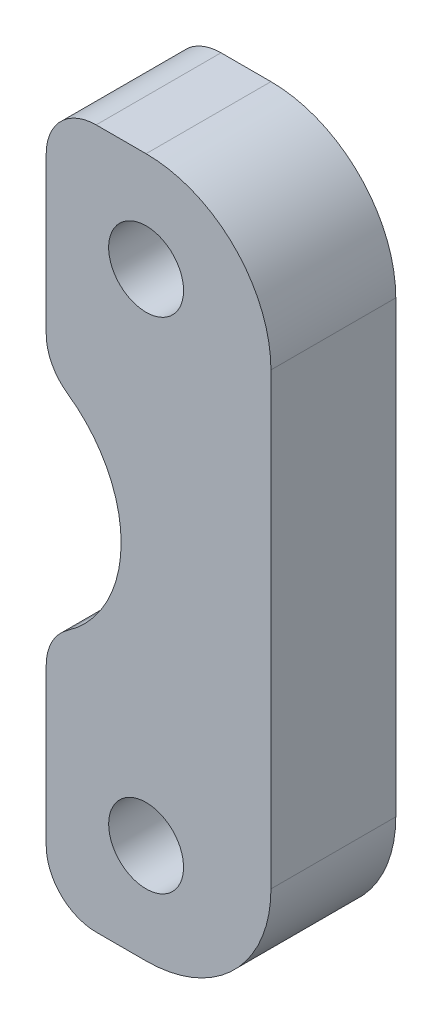
ISO-10303-21;
HEADER;
FILE_DESCRIPTION(('STEP AP214'),'2;1');
FILE_NAME('part.step','',(''),(''),'','','');
FILE_SCHEMA(('AUTOMOTIVE_DESIGN { 1 0 10303 214 1 1 1 1 }'));
ENDSEC;
DATA;
#1=APPLICATION_CONTEXT('core data for automotive mechanical design processes');
#2=APPLICATION_PROTOCOL_DEFINITION('international standard','automotive_design',2000,#1);
#3=PRODUCT_CONTEXT('',#1,'mechanical');
#4=PRODUCT('Part','Part','',(#3));
#5=PRODUCT_RELATED_PRODUCT_CATEGORY('part','',(#4));
#6=PRODUCT_DEFINITION_FORMATION('','',#4);
#7=PRODUCT_DEFINITION_CONTEXT('part definition',#1,'design');
#8=PRODUCT_DEFINITION('design','',#6,#7);
#9=PRODUCT_DEFINITION_SHAPE('','',#8);
#10=(LENGTH_UNIT() NAMED_UNIT(*) SI_UNIT(.MILLI.,.METRE.));
#11=(NAMED_UNIT(*) PLANE_ANGLE_UNIT() SI_UNIT($,.RADIAN.));
#12=(NAMED_UNIT(*) SI_UNIT($,.STERADIAN.) SOLID_ANGLE_UNIT());
#13=UNCERTAINTY_MEASURE_WITH_UNIT(LENGTH_MEASURE(1.E-05),#10,'distance_accuracy_value','');
#14=(GEOMETRIC_REPRESENTATION_CONTEXT(3) GLOBAL_UNCERTAINTY_ASSIGNED_CONTEXT((#13)) GLOBAL_UNIT_ASSIGNED_CONTEXT((#10,
#11,#12)) REPRESENTATION_CONTEXT('',''));
#15=CARTESIAN_POINT('',(0.,0.,0.));
#16=DIRECTION('',(0.,0.,1.));
#17=DIRECTION('',(1.,0.,0.));
#18=AXIS2_PLACEMENT_3D('',#15,#16,#17);
#19=CARTESIAN_POINT('',(0.,0.,5.));
#20=DIRECTION('',(0.,0.,-1.));
#21=DIRECTION('',(-1.,0.,0.));
#22=AXIS2_PLACEMENT_3D('',#19,#20,#21);
#23=PLANE('',#22);
#24=DIRECTION('',(0.,-1.,0.));
#25=VECTOR('',#24,1.);
#26=CARTESIAN_POINT('',(2.,-14.,5.));
#27=LINE('',#26,#25);
#28=CARTESIAN_POINT('',(2.,-5.74456264653803,5.));
#29=VERTEX_POINT('',#28);
#30=CARTESIAN_POINT('',(2.,-12.,5.));
#31=VERTEX_POINT('',#30);
#32=EDGE_CURVE('E232',#29,#31,#27,.T.);
#33=ORIENTED_EDGE('',*,*,#32,.T.);
#34=CARTESIAN_POINT('',(4.,-12.,5.));
#35=DIRECTION('',(0.,0.,-1.));
#36=DIRECTION('',(-1.,0.,0.));
#37=AXIS2_PLACEMENT_3D('',#34,#35,#36);
#38=CIRCLE('',#37,2.);
#39=CARTESIAN_POINT('',(4.,-14.,5.));
#40=VERTEX_POINT('',#39);
#41=EDGE_CURVE('E193',#31,#40,#38,.F.);
#42=ORIENTED_EDGE('',*,*,#41,.T.);
#43=DIRECTION('',(1.,0.,0.));
#44=VECTOR('',#43,1.);
#45=CARTESIAN_POINT('',(11.,-14.,5.));
#46=LINE('',#45,#44);
#47=CARTESIAN_POINT('',(6.,-14.,5.));
#48=VERTEX_POINT('',#47);
#49=EDGE_CURVE('E230',#40,#48,#46,.T.);
#50=ORIENTED_EDGE('',*,*,#49,.T.);
#51=CARTESIAN_POINT('',(6.,-9.,5.));
#52=DIRECTION('',(0.,0.,-1.));
#53=DIRECTION('',(-1.,0.,0.));
#54=AXIS2_PLACEMENT_3D('',#51,#52,#53);
#55=CIRCLE('',#54,5.);
#56=CARTESIAN_POINT('',(11.,-9.,5.));
#57=VERTEX_POINT('',#56);
#58=EDGE_CURVE('E167',#48,#57,#55,.F.);
#59=ORIENTED_EDGE('',*,*,#58,.T.);
#60=DIRECTION('',(0.,1.,0.));
#61=VECTOR('',#60,1.);
#62=CARTESIAN_POINT('',(11.,14.,5.));
#63=LINE('',#62,#61);
#64=CARTESIAN_POINT('',(11.,9.,5.));
#65=VERTEX_POINT('',#64);
#66=EDGE_CURVE('E146',#57,#65,#63,.T.);
#67=ORIENTED_EDGE('',*,*,#66,.T.);
#68=CARTESIAN_POINT('',(6.,9.,5.));
#69=DIRECTION('',(0.,0.,-1.));
#70=DIRECTION('',(-1.,0.,0.));
#71=AXIS2_PLACEMENT_3D('',#68,#69,#70);
#72=CIRCLE('',#71,5.);
#73=CARTESIAN_POINT('',(6.,14.,5.));
#74=VERTEX_POINT('',#73);
#75=EDGE_CURVE('E165',#65,#74,#72,.F.);
#76=ORIENTED_EDGE('',*,*,#75,.T.);
#77=DIRECTION('',(-1.,0.,0.));
#78=VECTOR('',#77,1.);
#79=CARTESIAN_POINT('',(2.,14.,5.));
#80=LINE('',#79,#78);
#81=CARTESIAN_POINT('',(4.,14.,5.));
#82=VERTEX_POINT('',#81);
#83=EDGE_CURVE('E152',#74,#82,#80,.T.);
#84=ORIENTED_EDGE('',*,*,#83,.T.);
#85=CARTESIAN_POINT('',(4.,12.,5.));
#86=DIRECTION('',(0.,0.,-1.));
#87=DIRECTION('',(-1.,0.,0.));
#88=AXIS2_PLACEMENT_3D('',#85,#86,#87);
#89=CIRCLE('',#88,2.);
#90=CARTESIAN_POINT('',(2.,12.,5.));
#91=VERTEX_POINT('',#90);
#92=EDGE_CURVE('E188',#82,#91,#89,.F.);
#93=ORIENTED_EDGE('',*,*,#92,.T.);
#94=DIRECTION('',(0.,-1.,0.));
#95=VECTOR('',#94,1.);
#96=CARTESIAN_POINT('',(2.,14.,5.));
#97=LINE('',#96,#95);
#98=CARTESIAN_POINT('',(2.,5.74456264653803,5.));
#99=VERTEX_POINT('',#98);
#100=EDGE_CURVE('E156',#91,#99,#97,.T.);
#101=ORIENTED_EDGE('',*,*,#100,.T.);
#102=CARTESIAN_POINT('',(4.,5.74456264653803,5.));
#103=DIRECTION('',(0.,0.,-1.));
#104=DIRECTION('',(-1.,0.,0.));
#105=AXIS2_PLACEMENT_3D('',#102,#103,#104);
#106=CIRCLE('',#105,2.);
#107=CARTESIAN_POINT('',(2.85714285714286,4.10325903324145,5.));
#108=VERTEX_POINT('',#107);
#109=EDGE_CURVE('E58',#99,#108,#106,.F.);
#110=ORIENTED_EDGE('',*,*,#109,.T.);
#111=CARTESIAN_POINT('',(0.,0.,5.));
#112=DIRECTION('',(0.,0.,-1.));
#113=DIRECTION('',(-1.,0.,0.));
#114=AXIS2_PLACEMENT_3D('',#111,#112,#113);
#115=CIRCLE('',#114,5.);
#116=CARTESIAN_POINT('',(2.85714285714286,-4.10325903324145,5.));
#117=VERTEX_POINT('',#116);
#118=EDGE_CURVE('E213',#108,#117,#115,.T.);
#119=ORIENTED_EDGE('',*,*,#118,.T.);
#120=CARTESIAN_POINT('',(4.,-5.74456264653803,5.));
#121=DIRECTION('',(0.,0.,-1.));
#122=DIRECTION('',(-1.,0.,0.));
#123=AXIS2_PLACEMENT_3D('',#120,#121,#122);
#124=CIRCLE('',#123,2.);
#125=EDGE_CURVE('E191',#117,#29,#124,.F.);
#126=ORIENTED_EDGE('',*,*,#125,.T.);
#127=EDGE_LOOP('',(#33,#42,#50,#59,#67,#76,#84,#93,#101,#110,#119,#126));
#128=FACE_BOUND('',#127,.T.);
#129=CARTESIAN_POINT('',(6.,10.,5.));
#130=DIRECTION('',(0.,0.,1.));
#131=DIRECTION('',(1.,0.,0.));
#132=AXIS2_PLACEMENT_3D('',#129,#130,#131);
#133=CIRCLE('',#132,1.5);
#134=CARTESIAN_POINT('',(7.5,10.,5.));
#135=VERTEX_POINT('',#134);
#136=EDGE_CURVE('E228',#135,#135,#133,.T.);
#137=ORIENTED_EDGE('',*,*,#136,.F.);
#138=EDGE_LOOP('',(#137));
#139=FACE_BOUND('',#138,.T.);
#140=CARTESIAN_POINT('',(6.,-10.,5.));
#141=DIRECTION('',(0.,0.,1.));
#142=DIRECTION('',(-1.,0.,0.));
#143=AXIS2_PLACEMENT_3D('',#140,#141,#142);
#144=CIRCLE('',#143,1.5);
#145=CARTESIAN_POINT('',(4.5,-10.,5.));
#146=VERTEX_POINT('',#145);
#147=EDGE_CURVE('E238',#146,#146,#144,.T.);
#148=ORIENTED_EDGE('',*,*,#147,.F.);
#149=EDGE_LOOP('',(#148));
#150=FACE_BOUND('',#149,.T.);
#151=ADVANCED_FACE('F36',(#128,#139,#150),#23,.F.);
#152=CARTESIAN_POINT('',(0.,0.,0.));
#153=DIRECTION('',(0.,0.,-1.));
#154=DIRECTION('',(-1.,0.,0.));
#155=AXIS2_PLACEMENT_3D('',#152,#153,#154);
#156=PLANE('',#155);
#157=CARTESIAN_POINT('',(6.,10.,0.));
#158=DIRECTION('',(0.,0.,1.));
#159=DIRECTION('',(1.,0.,0.));
#160=AXIS2_PLACEMENT_3D('',#157,#158,#159);
#161=CIRCLE('',#160,1.5);
#162=CARTESIAN_POINT('',(7.5,10.,0.));
#163=VERTEX_POINT('',#162);
#164=EDGE_CURVE('E235',#163,#163,#161,.T.);
#165=ORIENTED_EDGE('',*,*,#164,.T.);
#166=EDGE_LOOP('',(#165));
#167=FACE_BOUND('',#166,.T.);
#168=DIRECTION('',(1.,0.,0.));
#169=VECTOR('',#168,1.);
#170=CARTESIAN_POINT('',(11.,-14.,0.));
#171=LINE('',#170,#169);
#172=CARTESIAN_POINT('',(4.,-14.,0.));
#173=VERTEX_POINT('',#172);
#174=CARTESIAN_POINT('',(6.,-14.,0.));
#175=VERTEX_POINT('',#174);
#176=EDGE_CURVE('E153',#173,#175,#171,.T.);
#177=ORIENTED_EDGE('',*,*,#176,.F.);
#178=CARTESIAN_POINT('',(4.,-12.,0.));
#179=DIRECTION('',(0.,0.,-1.));
#180=DIRECTION('',(-1.,0.,0.));
#181=AXIS2_PLACEMENT_3D('',#178,#179,#180);
#182=CIRCLE('',#181,2.);
#183=CARTESIAN_POINT('',(2.,-12.,0.));
#184=VERTEX_POINT('',#183);
#185=EDGE_CURVE('E181',#173,#184,#182,.T.);
#186=ORIENTED_EDGE('',*,*,#185,.T.);
#187=DIRECTION('',(0.,-1.,0.));
#188=VECTOR('',#187,1.);
#189=CARTESIAN_POINT('',(2.,-14.,0.));
#190=LINE('',#189,#188);
#191=CARTESIAN_POINT('',(2.,-5.74456264653803,0.));
#192=VERTEX_POINT('',#191);
#193=EDGE_CURVE('E158',#192,#184,#190,.T.);
#194=ORIENTED_EDGE('',*,*,#193,.F.);
#195=CARTESIAN_POINT('',(4.,-5.74456264653803,0.));
#196=DIRECTION('',(0.,0.,-1.));
#197=DIRECTION('',(-1.,0.,0.));
#198=AXIS2_PLACEMENT_3D('',#195,#196,#197);
#199=CIRCLE('',#198,2.);
#200=CARTESIAN_POINT('',(2.85714285714286,-4.10325903324145,0.));
#201=VERTEX_POINT('',#200);
#202=EDGE_CURVE('E179',#192,#201,#199,.T.);
#203=ORIENTED_EDGE('',*,*,#202,.T.);
#204=CARTESIAN_POINT('',(0.,0.,0.));
#205=DIRECTION('',(0.,0.,-1.));
#206=DIRECTION('',(-1.,0.,0.));
#207=AXIS2_PLACEMENT_3D('',#204,#205,#206);
#208=CIRCLE('',#207,5.);
#209=CARTESIAN_POINT('',(2.85714285714286,4.10325903324145,0.));
#210=VERTEX_POINT('',#209);
#211=EDGE_CURVE('E219',#210,#201,#208,.T.);
#212=ORIENTED_EDGE('',*,*,#211,.F.);
#213=CARTESIAN_POINT('',(4.,5.74456264653803,0.));
#214=DIRECTION('',(0.,0.,-1.));
#215=DIRECTION('',(-1.,0.,0.));
#216=AXIS2_PLACEMENT_3D('',#213,#214,#215);
#217=CIRCLE('',#216,2.);
#218=CARTESIAN_POINT('',(2.,5.74456264653803,0.));
#219=VERTEX_POINT('',#218);
#220=EDGE_CURVE('E177',#210,#219,#217,.T.);
#221=ORIENTED_EDGE('',*,*,#220,.T.);
#222=DIRECTION('',(0.,-1.,0.));
#223=VECTOR('',#222,1.);
#224=CARTESIAN_POINT('',(2.,14.,0.));
#225=LINE('',#224,#223);
#226=CARTESIAN_POINT('',(2.,12.,0.));
#227=VERTEX_POINT('',#226);
#228=EDGE_CURVE('E208',#227,#219,#225,.T.);
#229=ORIENTED_EDGE('',*,*,#228,.F.);
#230=CARTESIAN_POINT('',(4.,12.,0.));
#231=DIRECTION('',(0.,0.,-1.));
#232=DIRECTION('',(-1.,0.,0.));
#233=AXIS2_PLACEMENT_3D('',#230,#231,#232);
#234=CIRCLE('',#233,2.);
#235=CARTESIAN_POINT('',(4.,14.,0.));
#236=VERTEX_POINT('',#235);
#237=EDGE_CURVE('E175',#227,#236,#234,.T.);
#238=ORIENTED_EDGE('',*,*,#237,.T.);
#239=DIRECTION('',(-1.,0.,0.));
#240=VECTOR('',#239,1.);
#241=CARTESIAN_POINT('',(2.,14.,0.));
#242=LINE('',#241,#240);
#243=CARTESIAN_POINT('',(6.,14.,0.));
#244=VERTEX_POINT('',#243);
#245=EDGE_CURVE('E223',#244,#236,#242,.T.);
#246=ORIENTED_EDGE('',*,*,#245,.F.);
#247=CARTESIAN_POINT('',(6.,9.,0.));
#248=DIRECTION('',(0.,0.,-1.));
#249=DIRECTION('',(-1.,0.,0.));
#250=AXIS2_PLACEMENT_3D('',#247,#248,#249);
#251=CIRCLE('',#250,5.);
#252=CARTESIAN_POINT('',(11.,9.,0.));
#253=VERTEX_POINT('',#252);
#254=EDGE_CURVE('E137',#244,#253,#251,.T.);
#255=ORIENTED_EDGE('',*,*,#254,.T.);
#256=DIRECTION('',(0.,1.,0.));
#257=VECTOR('',#256,1.);
#258=CARTESIAN_POINT('',(11.,14.,0.));
#259=LINE('',#258,#257);
#260=CARTESIAN_POINT('',(11.,-9.,0.));
#261=VERTEX_POINT('',#260);
#262=EDGE_CURVE('E143',#261,#253,#259,.T.);
#263=ORIENTED_EDGE('',*,*,#262,.F.);
#264=CARTESIAN_POINT('',(6.,-9.,0.));
#265=DIRECTION('',(0.,0.,-1.));
#266=DIRECTION('',(-1.,0.,0.));
#267=AXIS2_PLACEMENT_3D('',#264,#265,#266);
#268=CIRCLE('',#267,5.);
#269=EDGE_CURVE('E127',#261,#175,#268,.T.);
#270=ORIENTED_EDGE('',*,*,#269,.T.);
#271=EDGE_LOOP('',(#177,#186,#194,#203,#212,#221,#229,#238,#246,#255,#263,#270));
#272=FACE_BOUND('',#271,.T.);
#273=CARTESIAN_POINT('',(6.,-10.,0.));
#274=DIRECTION('',(0.,0.,1.));
#275=DIRECTION('',(-1.,0.,0.));
#276=AXIS2_PLACEMENT_3D('',#273,#274,#275);
#277=CIRCLE('',#276,1.5);
#278=CARTESIAN_POINT('',(4.5,-10.,0.));
#279=VERTEX_POINT('',#278);
#280=EDGE_CURVE('E241',#279,#279,#277,.T.);
#281=ORIENTED_EDGE('',*,*,#280,.T.);
#282=EDGE_LOOP('',(#281));
#283=FACE_BOUND('',#282,.T.);
#284=ADVANCED_FACE('F149',(#167,#272,#283),#156,.T.);
#285=CARTESIAN_POINT('',(2.,14.,5.));
#286=DIRECTION('',(0.,-1.,0.));
#287=DIRECTION('',(0.,0.,-1.));
#288=AXIS2_PLACEMENT_3D('',#285,#286,#287);
#289=PLANE('',#288);
#290=ORIENTED_EDGE('',*,*,#245,.T.);
#291=DIRECTION('',(0.,0.,-1.));
#292=VECTOR('',#291,1.);
#293=CARTESIAN_POINT('',(4.,14.,5.));
#294=LINE('',#293,#292);
#295=EDGE_CURVE('E11',#236,#82,#294,.F.);
#296=ORIENTED_EDGE('',*,*,#295,.T.);
#297=ORIENTED_EDGE('',*,*,#83,.F.);
#298=DIRECTION('',(0.,0.,-1.));
#299=VECTOR('',#298,1.);
#300=CARTESIAN_POINT('',(6.,14.,5.));
#301=LINE('',#300,#299);
#302=EDGE_CURVE('E169',#74,#244,#301,.T.);
#303=ORIENTED_EDGE('',*,*,#302,.T.);
#304=EDGE_LOOP('',(#290,#296,#297,#303));
#305=FACE_BOUND('',#304,.T.);
#306=ADVANCED_FACE('F255',(#305),#289,.F.);
#307=CARTESIAN_POINT('',(2.,14.,5.));
#308=DIRECTION('',(1.,0.,0.));
#309=DIRECTION('',(0.,0.,-1.));
#310=AXIS2_PLACEMENT_3D('',#307,#308,#309);
#311=PLANE('',#310);
#312=ORIENTED_EDGE('',*,*,#228,.T.);
#313=DIRECTION('',(0.,0.,-1.));
#314=VECTOR('',#313,1.);
#315=CARTESIAN_POINT('',(2.,5.74456264653803,5.));
#316=LINE('',#315,#314);
#317=EDGE_CURVE('E44',#219,#99,#316,.F.);
#318=ORIENTED_EDGE('',*,*,#317,.T.);
#319=ORIENTED_EDGE('',*,*,#100,.F.);
#320=DIRECTION('',(0.,0.,-1.));
#321=VECTOR('',#320,1.);
#322=CARTESIAN_POINT('',(2.,12.,5.));
#323=LINE('',#322,#321);
#324=EDGE_CURVE('E199',#91,#227,#323,.T.);
#325=ORIENTED_EDGE('',*,*,#324,.T.);
#326=EDGE_LOOP('',(#312,#318,#319,#325));
#327=FACE_BOUND('',#326,.T.);
#328=ADVANCED_FACE('F205',(#327),#311,.F.);
#329=CARTESIAN_POINT('',(0.,0.,5.));
#330=DIRECTION('',(0.,0.,-1.));
#331=DIRECTION('',(-1.,0.,0.));
#332=AXIS2_PLACEMENT_3D('',#329,#330,#331);
#333=CYLINDRICAL_SURFACE('',#332,5.);
#334=ORIENTED_EDGE('',*,*,#211,.T.);
#335=DIRECTION('',(0.,0.,-1.));
#336=VECTOR('',#335,1.);
#337=CARTESIAN_POINT('',(2.85714285714286,-4.10325903324145,5.));
#338=LINE('',#337,#336);
#339=EDGE_CURVE('E51',#201,#117,#338,.F.);
#340=ORIENTED_EDGE('',*,*,#339,.T.);
#341=ORIENTED_EDGE('',*,*,#118,.F.);
#342=DIRECTION('',(0.,0.,-1.));
#343=VECTOR('',#342,1.);
#344=CARTESIAN_POINT('',(2.85714285714286,4.10325903324145,5.));
#345=LINE('',#344,#343);
#346=EDGE_CURVE('E195',#108,#210,#345,.T.);
#347=ORIENTED_EDGE('',*,*,#346,.T.);
#348=EDGE_LOOP('',(#334,#340,#341,#347));
#349=FACE_BOUND('',#348,.T.);
#350=ADVANCED_FACE('F218',(#349),#333,.F.);
#351=CARTESIAN_POINT('',(2.,-14.,5.));
#352=DIRECTION('',(1.,0.,0.));
#353=DIRECTION('',(0.,1.,0.));
#354=AXIS2_PLACEMENT_3D('',#351,#352,#353);
#355=PLANE('',#354);
#356=ORIENTED_EDGE('',*,*,#193,.T.);
#357=DIRECTION('',(0.,0.,-1.));
#358=VECTOR('',#357,1.);
#359=CARTESIAN_POINT('',(2.,-12.,5.));
#360=LINE('',#359,#358);
#361=EDGE_CURVE('E186',#184,#31,#360,.F.);
#362=ORIENTED_EDGE('',*,*,#361,.T.);
#363=ORIENTED_EDGE('',*,*,#32,.F.);
#364=DIRECTION('',(0.,0.,-1.));
#365=VECTOR('',#364,1.);
#366=CARTESIAN_POINT('',(2.,-5.74456264653803,5.));
#367=LINE('',#366,#365);
#368=EDGE_CURVE('E183',#29,#192,#367,.T.);
#369=ORIENTED_EDGE('',*,*,#368,.T.);
#370=EDGE_LOOP('',(#356,#362,#363,#369));
#371=FACE_BOUND('',#370,.T.);
#372=ADVANCED_FACE('F267',(#371),#355,.F.);
#373=CARTESIAN_POINT('',(11.,-14.,5.));
#374=DIRECTION('',(0.,1.,0.));
#375=DIRECTION('',(0.,0.,1.));
#376=AXIS2_PLACEMENT_3D('',#373,#374,#375);
#377=PLANE('',#376);
#378=ORIENTED_EDGE('',*,*,#49,.F.);
#379=DIRECTION('',(0.,0.,-1.));
#380=VECTOR('',#379,1.);
#381=CARTESIAN_POINT('',(4.,-14.,5.));
#382=LINE('',#381,#380);
#383=EDGE_CURVE('E172',#40,#173,#382,.T.);
#384=ORIENTED_EDGE('',*,*,#383,.T.);
#385=ORIENTED_EDGE('',*,*,#176,.T.);
#386=DIRECTION('',(0.,0.,-1.));
#387=VECTOR('',#386,1.);
#388=CARTESIAN_POINT('',(6.,-14.,5.));
#389=LINE('',#388,#387);
#390=EDGE_CURVE('E133',#175,#48,#389,.F.);
#391=ORIENTED_EDGE('',*,*,#390,.T.);
#392=EDGE_LOOP('',(#378,#384,#385,#391));
#393=FACE_BOUND('',#392,.T.);
#394=ADVANCED_FACE('F264',(#393),#377,.F.);
#395=CARTESIAN_POINT('',(11.,14.,5.));
#396=DIRECTION('',(-1.,0.,0.));
#397=DIRECTION('',(0.,0.,1.));
#398=AXIS2_PLACEMENT_3D('',#395,#396,#397);
#399=PLANE('',#398);
#400=ORIENTED_EDGE('',*,*,#66,.F.);
#401=DIRECTION('',(0.,0.,-1.));
#402=VECTOR('',#401,1.);
#403=CARTESIAN_POINT('',(11.,-9.,5.));
#404=LINE('',#403,#402);
#405=EDGE_CURVE('E131',#57,#261,#404,.T.);
#406=ORIENTED_EDGE('',*,*,#405,.T.);
#407=ORIENTED_EDGE('',*,*,#262,.T.);
#408=DIRECTION('',(0.,0.,-1.));
#409=VECTOR('',#408,1.);
#410=CARTESIAN_POINT('',(11.,9.,5.));
#411=LINE('',#410,#409);
#412=EDGE_CURVE('E147',#253,#65,#411,.F.);
#413=ORIENTED_EDGE('',*,*,#412,.T.);
#414=EDGE_LOOP('',(#400,#406,#407,#413));
#415=FACE_BOUND('',#414,.T.);
#416=ADVANCED_FACE('F142',(#415),#399,.F.);
#417=CARTESIAN_POINT('',(6.,10.,5.));
#418=DIRECTION('',(0.,0.,-1.));
#419=DIRECTION('',(-1.,0.,0.));
#420=AXIS2_PLACEMENT_3D('',#417,#418,#419);
#421=CYLINDRICAL_SURFACE('',#420,1.5);
#422=ORIENTED_EDGE('',*,*,#136,.T.);
#423=EDGE_LOOP('',(#422));
#424=FACE_BOUND('',#423,.T.);
#425=ORIENTED_EDGE('',*,*,#164,.F.);
#426=EDGE_LOOP('',(#425));
#427=FACE_BOUND('',#426,.T.);
#428=ADVANCED_FACE('F259',(#424,#427),#421,.F.);
#429=CARTESIAN_POINT('',(6.,-10.,5.));
#430=DIRECTION('',(0.,0.,-1.));
#431=DIRECTION('',(-1.,0.,0.));
#432=AXIS2_PLACEMENT_3D('',#429,#430,#431);
#433=CYLINDRICAL_SURFACE('',#432,1.5);
#434=ORIENTED_EDGE('',*,*,#147,.T.);
#435=EDGE_LOOP('',(#434));
#436=FACE_BOUND('',#435,.T.);
#437=ORIENTED_EDGE('',*,*,#280,.F.);
#438=EDGE_LOOP('',(#437));
#439=FACE_BOUND('',#438,.T.);
#440=ADVANCED_FACE('F247',(#436,#439),#433,.F.);
#441=CARTESIAN_POINT('',(6.,-9.,5.));
#442=DIRECTION('',(0.,0.,-1.));
#443=DIRECTION('',(-1.,0.,0.));
#444=AXIS2_PLACEMENT_3D('',#441,#442,#443);
#445=CYLINDRICAL_SURFACE('',#444,5.);
#446=ORIENTED_EDGE('',*,*,#58,.F.);
#447=ORIENTED_EDGE('',*,*,#390,.F.);
#448=ORIENTED_EDGE('',*,*,#269,.F.);
#449=ORIENTED_EDGE('',*,*,#405,.F.);
#450=EDGE_LOOP('',(#446,#447,#448,#449));
#451=FACE_BOUND('',#450,.T.);
#452=ADVANCED_FACE('F130',(#451),#445,.T.);
#453=CARTESIAN_POINT('',(6.,9.,5.));
#454=DIRECTION('',(0.,0.,-1.));
#455=DIRECTION('',(-1.,0.,0.));
#456=AXIS2_PLACEMENT_3D('',#453,#454,#455);
#457=CYLINDRICAL_SURFACE('',#456,5.);
#458=ORIENTED_EDGE('',*,*,#75,.F.);
#459=ORIENTED_EDGE('',*,*,#412,.F.);
#460=ORIENTED_EDGE('',*,*,#254,.F.);
#461=ORIENTED_EDGE('',*,*,#302,.F.);
#462=EDGE_LOOP('',(#458,#459,#460,#461));
#463=FACE_BOUND('',#462,.T.);
#464=ADVANCED_FACE('F281',(#463),#457,.T.);
#465=CARTESIAN_POINT('',(4.,-12.,5.));
#466=DIRECTION('',(0.,0.,-1.));
#467=DIRECTION('',(-1.,0.,0.));
#468=AXIS2_PLACEMENT_3D('',#465,#466,#467);
#469=CYLINDRICAL_SURFACE('',#468,2.);
#470=ORIENTED_EDGE('',*,*,#41,.F.);
#471=ORIENTED_EDGE('',*,*,#361,.F.);
#472=ORIENTED_EDGE('',*,*,#185,.F.);
#473=ORIENTED_EDGE('',*,*,#383,.F.);
#474=EDGE_LOOP('',(#470,#471,#472,#473));
#475=FACE_BOUND('',#474,.T.);
#476=ADVANCED_FACE('F284',(#475),#469,.T.);
#477=CARTESIAN_POINT('',(4.,-5.74456264653803,5.));
#478=DIRECTION('',(0.,0.,-1.));
#479=DIRECTION('',(-1.,0.,0.));
#480=AXIS2_PLACEMENT_3D('',#477,#478,#479);
#481=CYLINDRICAL_SURFACE('',#480,2.);
#482=ORIENTED_EDGE('',*,*,#125,.F.);
#483=ORIENTED_EDGE('',*,*,#339,.F.);
#484=ORIENTED_EDGE('',*,*,#202,.F.);
#485=ORIENTED_EDGE('',*,*,#368,.F.);
#486=EDGE_LOOP('',(#482,#483,#484,#485));
#487=FACE_BOUND('',#486,.T.);
#488=ADVANCED_FACE('F288',(#487),#481,.T.);
#489=CARTESIAN_POINT('',(4.,5.74456264653803,5.));
#490=DIRECTION('',(0.,0.,-1.));
#491=DIRECTION('',(-1.,0.,0.));
#492=AXIS2_PLACEMENT_3D('',#489,#490,#491);
#493=CYLINDRICAL_SURFACE('',#492,2.);
#494=ORIENTED_EDGE('',*,*,#109,.F.);
#495=ORIENTED_EDGE('',*,*,#317,.F.);
#496=ORIENTED_EDGE('',*,*,#220,.F.);
#497=ORIENTED_EDGE('',*,*,#346,.F.);
#498=EDGE_LOOP('',(#494,#495,#496,#497));
#499=FACE_BOUND('',#498,.T.);
#500=ADVANCED_FACE('F216',(#499),#493,.T.);
#501=CARTESIAN_POINT('',(4.,12.,5.));
#502=DIRECTION('',(0.,0.,-1.));
#503=DIRECTION('',(-1.,0.,0.));
#504=AXIS2_PLACEMENT_3D('',#501,#502,#503);
#505=CYLINDRICAL_SURFACE('',#504,2.);
#506=ORIENTED_EDGE('',*,*,#92,.F.);
#507=ORIENTED_EDGE('',*,*,#295,.F.);
#508=ORIENTED_EDGE('',*,*,#237,.F.);
#509=ORIENTED_EDGE('',*,*,#324,.F.);
#510=EDGE_LOOP('',(#506,#507,#508,#509));
#511=FACE_BOUND('',#510,.T.);
#512=ADVANCED_FACE('F38',(#511),#505,.T.);
#513=CLOSED_SHELL('',(#151,#284,#306,#328,#350,#372,#394,#416,#428,#440,#452,#464,#476,#488,
#500,#512));
#514=MANIFOLD_SOLID_BREP('B2',#513);
#515=ADVANCED_BREP_SHAPE_REPRESENTATION('',(#18,#514),#14);
#516=SHAPE_DEFINITION_REPRESENTATION(#9,#515);
ENDSEC;
END-ISO-10303-21;
